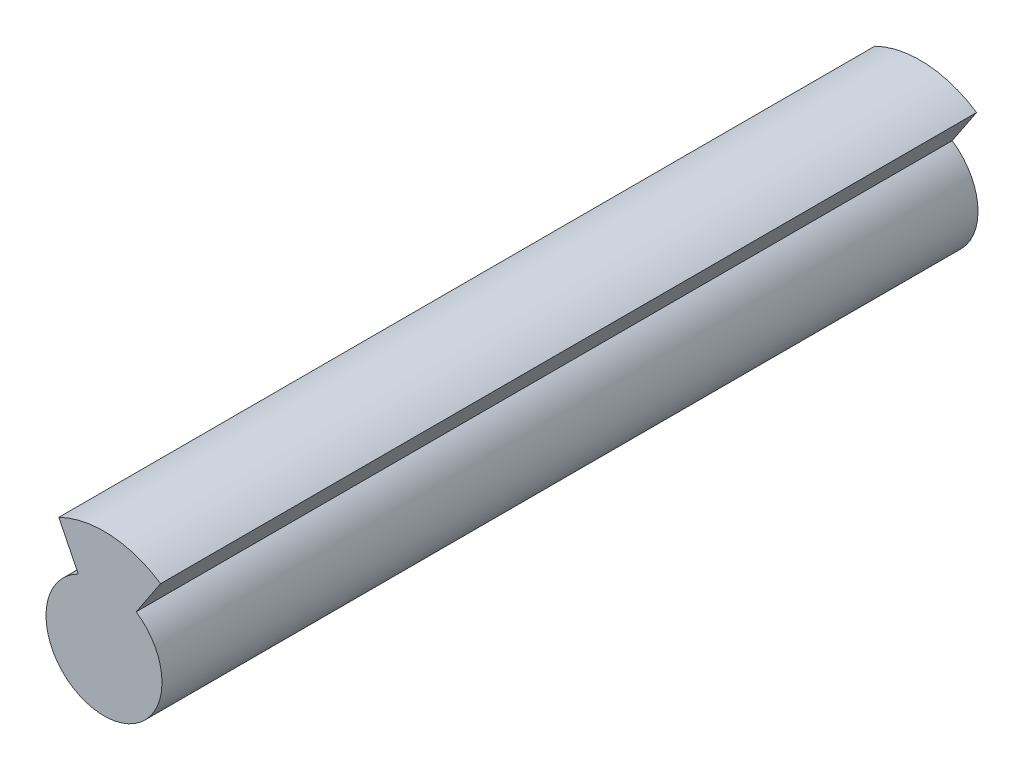
ISO-10303-21;
HEADER;
FILE_DESCRIPTION(('STEP AP214'),'2;1');
FILE_NAME('part.step','',(''),(''),'','','');
FILE_SCHEMA(('AUTOMOTIVE_DESIGN { 1 0 10303 214 1 1 1 1 }'));
ENDSEC;
DATA;
#1=APPLICATION_CONTEXT('core data for automotive mechanical design processes');
#2=APPLICATION_PROTOCOL_DEFINITION('international standard','automotive_design',2000,#1);
#3=PRODUCT_CONTEXT('',#1,'mechanical');
#4=PRODUCT('Part','Part','',(#3));
#5=PRODUCT_RELATED_PRODUCT_CATEGORY('part','',(#4));
#6=PRODUCT_DEFINITION_FORMATION('','',#4);
#7=PRODUCT_DEFINITION_CONTEXT('part definition',#1,'design');
#8=PRODUCT_DEFINITION('design','',#6,#7);
#9=PRODUCT_DEFINITION_SHAPE('','',#8);
#10=(LENGTH_UNIT() NAMED_UNIT(*) SI_UNIT(.MILLI.,.METRE.));
#11=(NAMED_UNIT(*) PLANE_ANGLE_UNIT() SI_UNIT($,.RADIAN.));
#12=(NAMED_UNIT(*) SI_UNIT($,.STERADIAN.) SOLID_ANGLE_UNIT());
#13=UNCERTAINTY_MEASURE_WITH_UNIT(LENGTH_MEASURE(1.E-05),#10,'distance_accuracy_value','');
#14=(GEOMETRIC_REPRESENTATION_CONTEXT(3) GLOBAL_UNCERTAINTY_ASSIGNED_CONTEXT((#13)) GLOBAL_UNIT_ASSIGNED_CONTEXT((#10,
#11,#12)) REPRESENTATION_CONTEXT('',''));
#15=CARTESIAN_POINT('',(0.,0.,0.));
#16=DIRECTION('',(0.,0.,1.));
#17=DIRECTION('',(1.,0.,0.));
#18=AXIS2_PLACEMENT_3D('',#15,#16,#17);
#19=CARTESIAN_POINT('',(0.,0.,120.));
#20=DIRECTION('',(0.,0.,-1.));
#21=DIRECTION('',(-1.,0.,0.));
#22=AXIS2_PLACEMENT_3D('',#19,#20,#21);
#23=CYLINDRICAL_SURFACE('',#22,8.53);
#24=CARTESIAN_POINT('',(0.,0.,0.));
#25=DIRECTION('',(0.,0.,1.));
#26=DIRECTION('',(1.,0.,0.));
#27=AXIS2_PLACEMENT_3D('',#24,#25,#26);
#28=CIRCLE('',#27,8.53);
#29=CARTESIAN_POINT('',(-3.77974214165183,7.64685878924289,0.));
#30=VERTEX_POINT('',#29);
#31=CARTESIAN_POINT('',(4.73250289981076,7.09678210904652,0.));
#32=VERTEX_POINT('',#31);
#33=EDGE_CURVE('E97',#30,#32,#28,.T.);
#34=ORIENTED_EDGE('',*,*,#33,.T.);
#35=DIRECTION('',(0.,0.,-1.));
#36=VECTOR('',#35,1.);
#37=CARTESIAN_POINT('',(4.73250289981076,7.09678210904652,120.));
#38=LINE('',#37,#36);
#39=CARTESIAN_POINT('',(4.73250289981076,7.09678210904652,120.));
#40=VERTEX_POINT('',#39);
#41=EDGE_CURVE('E11',#40,#32,#38,.T.);
#42=ORIENTED_EDGE('',*,*,#41,.F.);
#43=CARTESIAN_POINT('',(0.,0.,120.));
#44=DIRECTION('',(0.,0.,1.));
#45=DIRECTION('',(1.,0.,0.));
#46=AXIS2_PLACEMENT_3D('',#43,#44,#45);
#47=CIRCLE('',#46,8.53);
#48=CARTESIAN_POINT('',(-3.77974214165183,7.64685878924289,120.));
#49=VERTEX_POINT('',#48);
#50=EDGE_CURVE('E82',#49,#40,#47,.T.);
#51=ORIENTED_EDGE('',*,*,#50,.F.);
#52=DIRECTION('',(0.,0.,-1.));
#53=VECTOR('',#52,1.);
#54=CARTESIAN_POINT('',(-3.77974214165183,7.64685878924289,120.));
#55=LINE('',#54,#53);
#56=EDGE_CURVE('E93',#49,#30,#55,.T.);
#57=ORIENTED_EDGE('',*,*,#56,.T.);
#58=EDGE_LOOP('',(#34,#42,#51,#57));
#59=FACE_BOUND('',#58,.T.);
#60=ADVANCED_FACE('F35',(#59),#23,.T.);
#61=CARTESIAN_POINT('',(0.,0.,120.));
#62=DIRECTION('',(-0.831979145257505,0.554806905018847,0.));
#63=DIRECTION('',(-0.554806905018847,-0.831979145257505,0.));
#64=AXIS2_PLACEMENT_3D('',#61,#62,#63);
#65=PLANE('',#64);
#66=DIRECTION('',(0.554806905018847,0.831979145257505,0.));
#67=VECTOR('',#66,1.);
#68=CARTESIAN_POINT('',(0.,0.,0.));
#69=LINE('',#68,#67);
#70=CARTESIAN_POINT('',(8.3221035752827,12.4796871788626,0.));
#71=VERTEX_POINT('',#70);
#72=EDGE_CURVE('E87',#32,#71,#69,.T.);
#73=ORIENTED_EDGE('',*,*,#72,.T.);
#74=DIRECTION('',(0.,0.,-1.));
#75=VECTOR('',#74,1.);
#76=CARTESIAN_POINT('',(8.3221035752827,12.4796871788626,120.));
#77=LINE('',#76,#75);
#78=CARTESIAN_POINT('',(8.3221035752827,12.4796871788626,120.));
#79=VERTEX_POINT('',#78);
#80=EDGE_CURVE('E43',#79,#71,#77,.T.);
#81=ORIENTED_EDGE('',*,*,#80,.F.);
#82=DIRECTION('',(0.554806905018847,0.831979145257505,0.));
#83=VECTOR('',#82,1.);
#84=CARTESIAN_POINT('',(0.,0.,120.));
#85=LINE('',#84,#83);
#86=EDGE_CURVE('E77',#40,#79,#85,.T.);
#87=ORIENTED_EDGE('',*,*,#86,.F.);
#88=ORIENTED_EDGE('',*,*,#41,.T.);
#89=EDGE_LOOP('',(#73,#81,#87,#88));
#90=FACE_BOUND('',#89,.T.);
#91=ADVANCED_FACE('F86',(#90),#65,.F.);
#92=CARTESIAN_POINT('',(0.,0.,120.));
#93=DIRECTION('',(0.,0.,-1.));
#94=DIRECTION('',(-1.,0.,0.));
#95=AXIS2_PLACEMENT_3D('',#92,#93,#94);
#96=CYLINDRICAL_SURFACE('',#95,15.);
#97=CARTESIAN_POINT('',(0.,0.,0.));
#98=DIRECTION('',(0.,0.,1.));
#99=DIRECTION('',(1.,0.,0.));
#100=AXIS2_PLACEMENT_3D('',#97,#98,#99);
#101=CIRCLE('',#100,15.);
#102=CARTESIAN_POINT('',(-6.64667434053662,13.4469966985514,0.));
#103=VERTEX_POINT('',#102);
#104=EDGE_CURVE('E101',#103,#71,#101,.F.);
#105=ORIENTED_EDGE('',*,*,#104,.F.);
#106=DIRECTION('',(0.,0.,-1.));
#107=VECTOR('',#106,1.);
#108=CARTESIAN_POINT('',(-6.64667434053662,13.4469966985514,120.));
#109=LINE('',#108,#107);
#110=CARTESIAN_POINT('',(-6.64667434053662,13.4469966985514,120.));
#111=VERTEX_POINT('',#110);
#112=EDGE_CURVE('E67',#111,#103,#109,.T.);
#113=ORIENTED_EDGE('',*,*,#112,.F.);
#114=CARTESIAN_POINT('',(0.,0.,120.));
#115=DIRECTION('',(0.,0.,1.));
#116=DIRECTION('',(1.,0.,0.));
#117=AXIS2_PLACEMENT_3D('',#114,#115,#116);
#118=CIRCLE('',#117,15.);
#119=EDGE_CURVE('E80',#111,#79,#118,.F.);
#120=ORIENTED_EDGE('',*,*,#119,.T.);
#121=ORIENTED_EDGE('',*,*,#80,.T.);
#122=EDGE_LOOP('',(#105,#113,#120,#121));
#123=FACE_BOUND('',#122,.T.);
#124=ADVANCED_FACE('F91',(#123),#96,.T.);
#125=CARTESIAN_POINT('',(0.,0.,120.));
#126=DIRECTION('',(0.896466446570093,0.443111622702441,0.));
#127=DIRECTION('',(-0.443111622702441,0.896466446570093,0.));
#128=AXIS2_PLACEMENT_3D('',#125,#126,#127);
#129=PLANE('',#128);
#130=DIRECTION('',(0.443111622702442,-0.896466446570093,0.));
#131=VECTOR('',#130,1.);
#132=CARTESIAN_POINT('',(0.,0.,0.));
#133=LINE('',#132,#131);
#134=EDGE_CURVE('E70',#103,#30,#133,.T.);
#135=ORIENTED_EDGE('',*,*,#134,.T.);
#136=ORIENTED_EDGE('',*,*,#56,.F.);
#137=DIRECTION('',(0.443111622702442,-0.896466446570093,0.));
#138=VECTOR('',#137,1.);
#139=CARTESIAN_POINT('',(0.,0.,120.));
#140=LINE('',#139,#138);
#141=EDGE_CURVE('E51',#111,#49,#140,.T.);
#142=ORIENTED_EDGE('',*,*,#141,.F.);
#143=ORIENTED_EDGE('',*,*,#112,.T.);
#144=EDGE_LOOP('',(#135,#136,#142,#143));
#145=FACE_BOUND('',#144,.T.);
#146=ADVANCED_FACE('F114',(#145),#129,.F.);
#147=CARTESIAN_POINT('',(0.,0.,120.));
#148=DIRECTION('',(0.,0.,1.));
#149=DIRECTION('',(1.,0.,0.));
#150=AXIS2_PLACEMENT_3D('',#147,#148,#149);
#151=PLANE('',#150);
#152=ORIENTED_EDGE('',*,*,#50,.T.);
#153=ORIENTED_EDGE('',*,*,#86,.T.);
#154=ORIENTED_EDGE('',*,*,#119,.F.);
#155=ORIENTED_EDGE('',*,*,#141,.T.);
#156=EDGE_LOOP('',(#152,#153,#154,#155));
#157=FACE_BOUND('',#156,.T.);
#158=ADVANCED_FACE('F78',(#157),#151,.T.);
#159=CARTESIAN_POINT('',(0.,0.,0.));
#160=DIRECTION('',(0.,0.,1.));
#161=DIRECTION('',(1.,0.,0.));
#162=AXIS2_PLACEMENT_3D('',#159,#160,#161);
#163=PLANE('',#162);
#164=ORIENTED_EDGE('',*,*,#33,.F.);
#165=ORIENTED_EDGE('',*,*,#134,.F.);
#166=ORIENTED_EDGE('',*,*,#104,.T.);
#167=ORIENTED_EDGE('',*,*,#72,.F.);
#168=EDGE_LOOP('',(#164,#165,#166,#167));
#169=FACE_BOUND('',#168,.T.);
#170=ADVANCED_FACE('F108',(#169),#163,.F.);
#171=CLOSED_SHELL('',(#60,#91,#124,#146,#158,#170));
#172=MANIFOLD_SOLID_BREP('B2',#171);
#173=ADVANCED_BREP_SHAPE_REPRESENTATION('',(#18,#172),#14);
#174=SHAPE_DEFINITION_REPRESENTATION(#9,#173);
ENDSEC;
END-ISO-10303-21;
